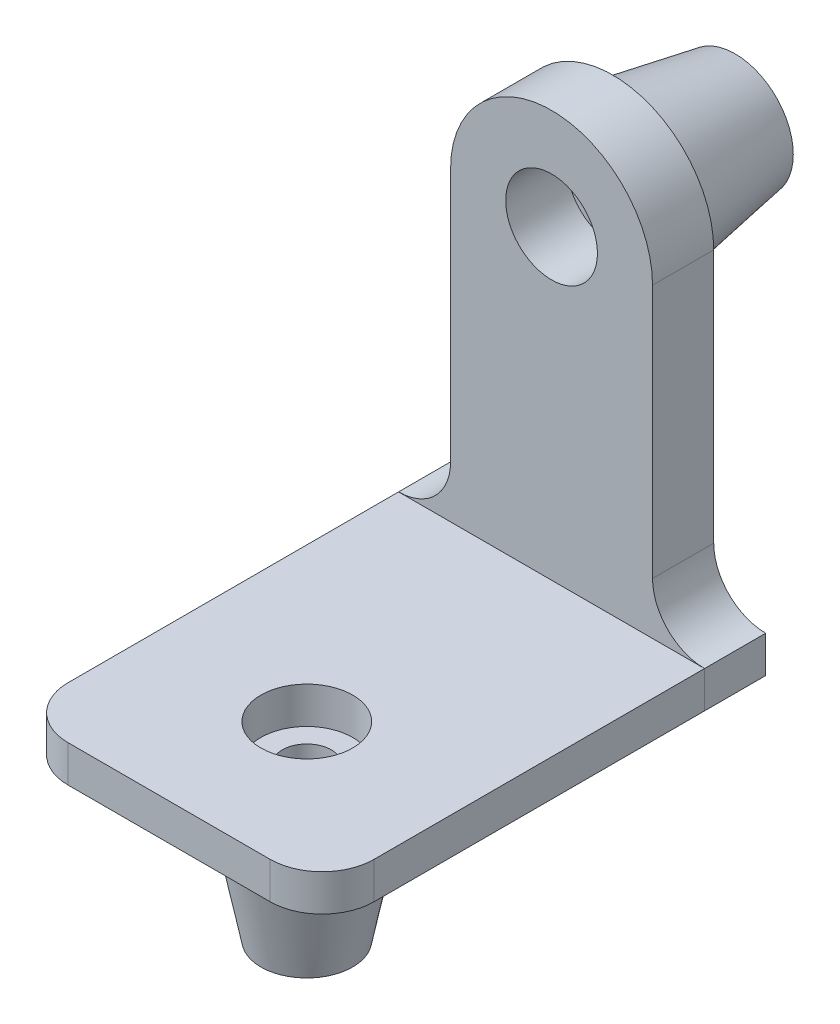
ISO-10303-21;
HEADER;
FILE_DESCRIPTION(('STEP AP214'),'2;1');
FILE_NAME('part.step','',(''),(''),'','','');
FILE_SCHEMA(('AUTOMOTIVE_DESIGN { 1 0 10303 214 1 1 1 1 }'));
ENDSEC;
DATA;
#1=APPLICATION_CONTEXT('core data for automotive mechanical design processes');
#2=APPLICATION_PROTOCOL_DEFINITION('international standard','automotive_design',2000,#1);
#3=PRODUCT_CONTEXT('',#1,'mechanical');
#4=PRODUCT('Part','Part','',(#3));
#5=PRODUCT_RELATED_PRODUCT_CATEGORY('part','',(#4));
#6=PRODUCT_DEFINITION_FORMATION('','',#4);
#7=PRODUCT_DEFINITION_CONTEXT('part definition',#1,'design');
#8=PRODUCT_DEFINITION('design','',#6,#7);
#9=PRODUCT_DEFINITION_SHAPE('','',#8);
#10=(LENGTH_UNIT() NAMED_UNIT(*) SI_UNIT(.MILLI.,.METRE.));
#11=(NAMED_UNIT(*) PLANE_ANGLE_UNIT() SI_UNIT($,.RADIAN.));
#12=(NAMED_UNIT(*) SI_UNIT($,.STERADIAN.) SOLID_ANGLE_UNIT());
#13=UNCERTAINTY_MEASURE_WITH_UNIT(LENGTH_MEASURE(1.E-05),#10,'distance_accuracy_value','');
#14=(GEOMETRIC_REPRESENTATION_CONTEXT(3) GLOBAL_UNCERTAINTY_ASSIGNED_CONTEXT((#13)) GLOBAL_UNIT_ASSIGNED_CONTEXT((#10,
#11,#12)) REPRESENTATION_CONTEXT('',''));
#15=CARTESIAN_POINT('',(0.,0.,0.));
#16=DIRECTION('',(0.,0.,1.));
#17=DIRECTION('',(1.,0.,0.));
#18=AXIS2_PLACEMENT_3D('',#15,#16,#17);
#19=CARTESIAN_POINT('',(50.,-12.,0.));
#20=DIRECTION('',(0.,0.,-1.));
#21=DIRECTION('',(-1.,0.,0.));
#22=AXIS2_PLACEMENT_3D('',#19,#20,#21);
#23=PLANE('',#22);
#24=DIRECTION('',(-1.,0.,0.));
#25=VECTOR('',#24,1.);
#26=CARTESIAN_POINT('',(50.,0.,0.));
#27=LINE('',#26,#25);
#28=CARTESIAN_POINT('',(50.,0.,0.));
#29=VERTEX_POINT('',#28);
#30=CARTESIAN_POINT('',(-50.,0.,0.));
#31=VERTEX_POINT('',#30);
#32=EDGE_CURVE('E117',#29,#31,#27,.T.);
#33=ORIENTED_EDGE('',*,*,#32,.T.);
#34=DIRECTION('',(0.,1.,0.));
#35=VECTOR('',#34,1.);
#36=CARTESIAN_POINT('',(-50.,-12.,0.));
#37=LINE('',#36,#35);
#38=CARTESIAN_POINT('',(-50.,-12.,0.));
#39=VERTEX_POINT('',#38);
#40=EDGE_CURVE('E13',#39,#31,#37,.T.);
#41=ORIENTED_EDGE('',*,*,#40,.F.);
#42=DIRECTION('',(-1.,0.,0.));
#43=VECTOR('',#42,1.);
#44=CARTESIAN_POINT('',(50.,-12.,0.));
#45=LINE('',#44,#43);
#46=CARTESIAN_POINT('',(50.,-12.,0.));
#47=VERTEX_POINT('',#46);
#48=EDGE_CURVE('E105',#47,#39,#45,.T.);
#49=ORIENTED_EDGE('',*,*,#48,.F.);
#50=DIRECTION('',(0.,1.,0.));
#51=VECTOR('',#50,1.);
#52=CARTESIAN_POINT('',(50.,-12.,0.));
#53=LINE('',#52,#51);
#54=EDGE_CURVE('E113',#47,#29,#53,.T.);
#55=ORIENTED_EDGE('',*,*,#54,.T.);
#56=EDGE_LOOP('',(#33,#41,#49,#55));
#57=FACE_BOUND('',#56,.T.);
#58=ADVANCED_FACE('F54',(#57),#23,.F.);
#59=CARTESIAN_POINT('',(-50.,-12.,0.));
#60=DIRECTION('',(1.,0.,0.));
#61=DIRECTION('',(0.,0.,-1.));
#62=AXIS2_PLACEMENT_3D('',#59,#60,#61);
#63=PLANE('',#62);
#64=DIRECTION('',(0.,0.,-1.));
#65=VECTOR('',#64,1.);
#66=CARTESIAN_POINT('',(-50.,0.,0.));
#67=LINE('',#66,#65);
#68=CARTESIAN_POINT('',(-50.,0.,-20.));
#69=VERTEX_POINT('',#68);
#70=EDGE_CURVE('E109',#31,#69,#67,.T.);
#71=ORIENTED_EDGE('',*,*,#70,.T.);
#72=DIRECTION('',(0.,1.,0.));
#73=VECTOR('',#72,1.);
#74=CARTESIAN_POINT('',(-50.,-12.,-20.));
#75=LINE('',#74,#73);
#76=CARTESIAN_POINT('',(-50.,-12.,-20.));
#77=VERTEX_POINT('',#76);
#78=EDGE_CURVE('E62',#77,#69,#75,.T.);
#79=ORIENTED_EDGE('',*,*,#78,.F.);
#80=DIRECTION('',(0.,0.,-1.));
#81=VECTOR('',#80,1.);
#82=CARTESIAN_POINT('',(-50.,-12.,0.));
#83=LINE('',#82,#81);
#84=EDGE_CURVE('E100',#39,#77,#83,.T.);
#85=ORIENTED_EDGE('',*,*,#84,.F.);
#86=ORIENTED_EDGE('',*,*,#40,.T.);
#87=EDGE_LOOP('',(#71,#79,#85,#86));
#88=FACE_BOUND('',#87,.T.);
#89=ADVANCED_FACE('F108',(#88),#63,.F.);
#90=CARTESIAN_POINT('',(-50.,-12.,-20.));
#91=DIRECTION('',(0.,0.,1.));
#92=DIRECTION('',(1.,0.,0.));
#93=AXIS2_PLACEMENT_3D('',#90,#91,#92);
#94=PLANE('',#93);
#95=DIRECTION('',(1.,0.,0.));
#96=VECTOR('',#95,1.);
#97=CARTESIAN_POINT('',(-50.,0.,-20.));
#98=LINE('',#97,#96);
#99=CARTESIAN_POINT('',(50.,0.,-20.));
#100=VERTEX_POINT('',#99);
#101=EDGE_CURVE('E87',#69,#100,#98,.T.);
#102=ORIENTED_EDGE('',*,*,#101,.T.);
#103=DIRECTION('',(0.,1.,0.));
#104=VECTOR('',#103,1.);
#105=CARTESIAN_POINT('',(50.,-12.,-20.));
#106=LINE('',#105,#104);
#107=CARTESIAN_POINT('',(50.,-12.,-20.));
#108=VERTEX_POINT('',#107);
#109=EDGE_CURVE('E110',#108,#100,#106,.T.);
#110=ORIENTED_EDGE('',*,*,#109,.F.);
#111=DIRECTION('',(1.,0.,0.));
#112=VECTOR('',#111,1.);
#113=CARTESIAN_POINT('',(-50.,-12.,-20.));
#114=LINE('',#113,#112);
#115=EDGE_CURVE('E103',#77,#108,#114,.T.);
#116=ORIENTED_EDGE('',*,*,#115,.F.);
#117=ORIENTED_EDGE('',*,*,#78,.T.);
#118=EDGE_LOOP('',(#102,#110,#116,#117));
#119=FACE_BOUND('',#118,.T.);
#120=ADVANCED_FACE('F111',(#119),#94,.F.);
#121=CARTESIAN_POINT('',(50.,-12.,-20.));
#122=DIRECTION('',(-1.,0.,0.));
#123=DIRECTION('',(0.,0.,1.));
#124=AXIS2_PLACEMENT_3D('',#121,#122,#123);
#125=PLANE('',#124);
#126=DIRECTION('',(0.,0.,1.));
#127=VECTOR('',#126,1.);
#128=CARTESIAN_POINT('',(50.,0.,-20.));
#129=LINE('',#128,#127);
#130=EDGE_CURVE('E93',#100,#29,#129,.T.);
#131=ORIENTED_EDGE('',*,*,#130,.T.);
#132=ORIENTED_EDGE('',*,*,#54,.F.);
#133=DIRECTION('',(0.,0.,1.));
#134=VECTOR('',#133,1.);
#135=CARTESIAN_POINT('',(50.,-12.,-20.));
#136=LINE('',#135,#134);
#137=EDGE_CURVE('E70',#108,#47,#136,.T.);
#138=ORIENTED_EDGE('',*,*,#137,.F.);
#139=ORIENTED_EDGE('',*,*,#109,.T.);
#140=EDGE_LOOP('',(#131,#132,#138,#139));
#141=FACE_BOUND('',#140,.T.);
#142=ADVANCED_FACE('F124',(#141),#125,.F.);
#143=CARTESIAN_POINT('',(0.,-12.,0.));
#144=DIRECTION('',(0.,-1.,0.));
#145=DIRECTION('',(0.,0.,-1.));
#146=AXIS2_PLACEMENT_3D('',#143,#144,#145);
#147=PLANE('',#146);
#148=ORIENTED_EDGE('',*,*,#48,.T.);
#149=ORIENTED_EDGE('',*,*,#84,.T.);
#150=ORIENTED_EDGE('',*,*,#115,.T.);
#151=ORIENTED_EDGE('',*,*,#137,.T.);
#152=EDGE_LOOP('',(#148,#149,#150,#151));
#153=FACE_BOUND('',#152,.T.);
#154=ADVANCED_FACE('F101',(#153),#147,.T.);
#155=CARTESIAN_POINT('',(0.,0.,0.));
#156=DIRECTION('',(0.,-1.,0.));
#157=DIRECTION('',(0.,0.,-1.));
#158=AXIS2_PLACEMENT_3D('',#155,#156,#157);
#159=PLANE('',#158);
#160=ORIENTED_EDGE('',*,*,#32,.F.);
#161=ORIENTED_EDGE('',*,*,#130,.F.);
#162=ORIENTED_EDGE('',*,*,#101,.F.);
#163=ORIENTED_EDGE('',*,*,#70,.F.);
#164=EDGE_LOOP('',(#160,#161,#162,#163));
#165=FACE_BOUND('',#164,.T.);
#166=ADVANCED_FACE('F127',(#165),#159,.F.);
#167=CLOSED_SHELL('',(#58,#89,#120,#142,#154,#166));
#168=MANIFOLD_SOLID_BREP('B2',#167);
#169=CARTESIAN_POINT('',(0.,-12.,0.));
#170=DIRECTION('',(0.,-1.,0.));
#171=DIRECTION('',(0.,0.,-1.));
#172=AXIS2_PLACEMENT_3D('',#169,#170,#171);
#173=PLANE('',#172);
#174=DIRECTION('',(1.,0.,0.));
#175=VECTOR('',#174,1.);
#176=CARTESIAN_POINT('',(50.,-12.,125.));
#177=LINE('',#176,#175);
#178=CARTESIAN_POINT('',(-33.,-12.,125.));
#179=VERTEX_POINT('',#178);
#180=CARTESIAN_POINT('',(33.,-12.,125.));
#181=VERTEX_POINT('',#180);
#182=EDGE_CURVE('E260',#179,#181,#177,.T.);
#183=ORIENTED_EDGE('',*,*,#182,.F.);
#184=CARTESIAN_POINT('',(-33.,-12.,108.));
#185=DIRECTION('',(0.,-1.,0.));
#186=DIRECTION('',(0.,0.,-1.));
#187=AXIS2_PLACEMENT_3D('',#184,#185,#186);
#188=CIRCLE('',#187,17.);
#189=CARTESIAN_POINT('',(-50.,-12.,108.));
#190=VERTEX_POINT('',#189);
#191=EDGE_CURVE('E196',#179,#190,#188,.T.);
#192=ORIENTED_EDGE('',*,*,#191,.T.);
#193=DIRECTION('',(0.,0.,1.));
#194=VECTOR('',#193,1.);
#195=CARTESIAN_POINT('',(-50.,-12.,125.));
#196=LINE('',#195,#194);
#197=CARTESIAN_POINT('',(-50.,-12.,0.));
#198=VERTEX_POINT('',#197);
#199=EDGE_CURVE('E245',#198,#190,#196,.T.);
#200=ORIENTED_EDGE('',*,*,#199,.F.);
#201=DIRECTION('',(-1.,0.,0.));
#202=VECTOR('',#201,1.);
#203=CARTESIAN_POINT('',(-50.,-12.,0.));
#204=LINE('',#203,#202);
#205=CARTESIAN_POINT('',(50.,-12.,0.));
#206=VERTEX_POINT('',#205);
#207=EDGE_CURVE('E258',#206,#198,#204,.T.);
#208=ORIENTED_EDGE('',*,*,#207,.F.);
#209=DIRECTION('',(0.,0.,-1.));
#210=VECTOR('',#209,1.);
#211=CARTESIAN_POINT('',(50.,-12.,0.));
#212=LINE('',#211,#210);
#213=CARTESIAN_POINT('',(50.,-12.,108.));
#214=VERTEX_POINT('',#213);
#215=EDGE_CURVE('E254',#214,#206,#212,.T.);
#216=ORIENTED_EDGE('',*,*,#215,.F.);
#217=CARTESIAN_POINT('',(33.,-12.,108.));
#218=DIRECTION('',(0.,-1.,0.));
#219=DIRECTION('',(0.,0.,-1.));
#220=AXIS2_PLACEMENT_3D('',#217,#218,#219);
#221=CIRCLE('',#220,17.);
#222=EDGE_CURVE('E208',#214,#181,#221,.T.);
#223=ORIENTED_EDGE('',*,*,#222,.T.);
#224=EDGE_LOOP('',(#183,#192,#200,#208,#216,#223));
#225=FACE_BOUND('',#224,.T.);
#226=CARTESIAN_POINT('',(0.,-12.,80.));
#227=DIRECTION('',(0.,-1.,0.));
#228=DIRECTION('',(0.,0.,-1.));
#229=AXIS2_PLACEMENT_3D('',#226,#227,#228);
#230=CIRCLE('',#229,25.);
#231=CARTESIAN_POINT('',(0.,-12.,55.));
#232=VERTEX_POINT('',#231);
#233=EDGE_CURVE('E409',#232,#232,#230,.T.);
#234=ORIENTED_EDGE('',*,*,#233,.F.);
#235=EDGE_LOOP('',(#234));
#236=FACE_BOUND('',#235,.T.);
#237=ADVANCED_FACE('F187',(#225,#236),#173,.T.);
#238=CARTESIAN_POINT('',(-50.,-12.,0.));
#239=DIRECTION('',(0.,0.,-1.));
#240=DIRECTION('',(-1.,0.,0.));
#241=AXIS2_PLACEMENT_3D('',#238,#239,#240);
#242=PLANE('',#241);
#243=DIRECTION('',(-1.,0.,0.));
#244=VECTOR('',#243,1.);
#245=CARTESIAN_POINT('',(-50.,0.,0.));
#246=LINE('',#245,#244);
#247=CARTESIAN_POINT('',(50.,0.,0.));
#248=VERTEX_POINT('',#247);
#249=CARTESIAN_POINT('',(-50.,0.,0.));
#250=VERTEX_POINT('',#249);
#251=EDGE_CURVE('E275',#248,#250,#246,.T.);
#252=ORIENTED_EDGE('',*,*,#251,.F.);
#253=DIRECTION('',(0.,1.,0.));
#254=VECTOR('',#253,1.);
#255=CARTESIAN_POINT('',(50.,-12.,0.));
#256=LINE('',#255,#254);
#257=EDGE_CURVE('E253',#206,#248,#256,.T.);
#258=ORIENTED_EDGE('',*,*,#257,.F.);
#259=ORIENTED_EDGE('',*,*,#207,.T.);
#260=DIRECTION('',(0.,1.,0.));
#261=VECTOR('',#260,1.);
#262=CARTESIAN_POINT('',(-50.,-12.,0.));
#263=LINE('',#262,#261);
#264=EDGE_CURVE('E241',#198,#250,#263,.T.);
#265=ORIENTED_EDGE('',*,*,#264,.T.);
#266=EDGE_LOOP('',(#252,#258,#259,#265));
#267=FACE_BOUND('',#266,.T.);
#268=ADVANCED_FACE('F263',(#267),#242,.T.);
#269=CARTESIAN_POINT('',(50.,-12.,0.));
#270=DIRECTION('',(1.,0.,0.));
#271=DIRECTION('',(0.,0.,-1.));
#272=AXIS2_PLACEMENT_3D('',#269,#270,#271);
#273=PLANE('',#272);
#274=DIRECTION('',(0.,0.,-1.));
#275=VECTOR('',#274,1.);
#276=CARTESIAN_POINT('',(50.,0.,0.));
#277=LINE('',#276,#275);
#278=CARTESIAN_POINT('',(50.,0.,108.));
#279=VERTEX_POINT('',#278);
#280=EDGE_CURVE('E265',#279,#248,#277,.T.);
#281=ORIENTED_EDGE('',*,*,#280,.F.);
#282=DIRECTION('',(0.,1.,0.));
#283=VECTOR('',#282,1.);
#284=CARTESIAN_POINT('',(50.,-12.,108.));
#285=LINE('',#284,#283);
#286=EDGE_CURVE('E52',#279,#214,#285,.F.);
#287=ORIENTED_EDGE('',*,*,#286,.T.);
#288=ORIENTED_EDGE('',*,*,#215,.T.);
#289=ORIENTED_EDGE('',*,*,#257,.T.);
#290=EDGE_LOOP('',(#281,#287,#288,#289));
#291=FACE_BOUND('',#290,.T.);
#292=ADVANCED_FACE('F303',(#291),#273,.T.);
#293=CARTESIAN_POINT('',(50.,-12.,125.));
#294=DIRECTION('',(0.,0.,1.));
#295=DIRECTION('',(1.,0.,0.));
#296=AXIS2_PLACEMENT_3D('',#293,#294,#295);
#297=PLANE('',#296);
#298=DIRECTION('',(1.,0.,0.));
#299=VECTOR('',#298,1.);
#300=CARTESIAN_POINT('',(50.,0.,125.));
#301=LINE('',#300,#299);
#302=CARTESIAN_POINT('',(-33.,0.,125.));
#303=VERTEX_POINT('',#302);
#304=CARTESIAN_POINT('',(33.,0.,125.));
#305=VERTEX_POINT('',#304);
#306=EDGE_CURVE('E267',#303,#305,#301,.T.);
#307=ORIENTED_EDGE('',*,*,#306,.F.);
#308=DIRECTION('',(0.,1.,0.));
#309=VECTOR('',#308,1.);
#310=CARTESIAN_POINT('',(-33.,-12.,125.));
#311=LINE('',#310,#309);
#312=EDGE_CURVE('E291',#303,#179,#311,.F.);
#313=ORIENTED_EDGE('',*,*,#312,.T.);
#314=ORIENTED_EDGE('',*,*,#182,.T.);
#315=DIRECTION('',(0.,1.,0.));
#316=VECTOR('',#315,1.);
#317=CARTESIAN_POINT('',(33.,-12.,125.));
#318=LINE('',#317,#316);
#319=EDGE_CURVE('E288',#181,#305,#318,.T.);
#320=ORIENTED_EDGE('',*,*,#319,.T.);
#321=EDGE_LOOP('',(#307,#313,#314,#320));
#322=FACE_BOUND('',#321,.T.);
#323=ADVANCED_FACE('F297',(#322),#297,.T.);
#324=CARTESIAN_POINT('',(-50.,-12.,125.));
#325=DIRECTION('',(-1.,0.,0.));
#326=DIRECTION('',(0.,0.,1.));
#327=AXIS2_PLACEMENT_3D('',#324,#325,#326);
#328=PLANE('',#327);
#329=ORIENTED_EDGE('',*,*,#199,.T.);
#330=DIRECTION('',(0.,1.,0.));
#331=VECTOR('',#330,1.);
#332=CARTESIAN_POINT('',(-50.,-12.,108.));
#333=LINE('',#332,#331);
#334=CARTESIAN_POINT('',(-50.,0.,108.));
#335=VERTEX_POINT('',#334);
#336=EDGE_CURVE('E281',#190,#335,#333,.T.);
#337=ORIENTED_EDGE('',*,*,#336,.T.);
#338=DIRECTION('',(0.,0.,1.));
#339=VECTOR('',#338,1.);
#340=CARTESIAN_POINT('',(-50.,0.,125.));
#341=LINE('',#340,#339);
#342=EDGE_CURVE('E248',#250,#335,#341,.T.);
#343=ORIENTED_EDGE('',*,*,#342,.F.);
#344=ORIENTED_EDGE('',*,*,#264,.F.);
#345=EDGE_LOOP('',(#329,#337,#343,#344));
#346=FACE_BOUND('',#345,.T.);
#347=ADVANCED_FACE('F243',(#346),#328,.T.);
#348=CARTESIAN_POINT('',(0.,0.,0.));
#349=DIRECTION('',(0.,-1.,0.));
#350=DIRECTION('',(0.,0.,-1.));
#351=AXIS2_PLACEMENT_3D('',#348,#349,#350);
#352=PLANE('',#351);
#353=CARTESIAN_POINT('',(0.,0.,80.));
#354=DIRECTION('',(0.,1.,0.));
#355=DIRECTION('',(0.,0.,1.));
#356=AXIS2_PLACEMENT_3D('',#353,#354,#355);
#357=CIRCLE('',#356,15.);
#358=CARTESIAN_POINT('',(0.,0.,95.));
#359=VERTEX_POINT('',#358);
#360=EDGE_CURVE('E270',#359,#359,#357,.T.);
#361=ORIENTED_EDGE('',*,*,#360,.F.);
#362=EDGE_LOOP('',(#361));
#363=FACE_BOUND('',#362,.T.);
#364=ORIENTED_EDGE('',*,*,#342,.T.);
#365=CARTESIAN_POINT('',(-33.,0.,108.));
#366=DIRECTION('',(0.,-1.,0.));
#367=DIRECTION('',(0.,0.,-1.));
#368=AXIS2_PLACEMENT_3D('',#365,#366,#367);
#369=CIRCLE('',#368,17.);
#370=EDGE_CURVE('E286',#335,#303,#369,.F.);
#371=ORIENTED_EDGE('',*,*,#370,.T.);
#372=ORIENTED_EDGE('',*,*,#306,.T.);
#373=CARTESIAN_POINT('',(33.,0.,108.));
#374=DIRECTION('',(0.,-1.,0.));
#375=DIRECTION('',(0.,0.,-1.));
#376=AXIS2_PLACEMENT_3D('',#373,#374,#375);
#377=CIRCLE('',#376,17.);
#378=EDGE_CURVE('E284',#305,#279,#377,.F.);
#379=ORIENTED_EDGE('',*,*,#378,.T.);
#380=ORIENTED_EDGE('',*,*,#280,.T.);
#381=ORIENTED_EDGE('',*,*,#251,.T.);
#382=EDGE_LOOP('',(#364,#371,#372,#379,#380,#381));
#383=FACE_BOUND('',#382,.T.);
#384=ADVANCED_FACE('F302',(#363,#383),#352,.F.);
#385=CARTESIAN_POINT('',(0.,-12.,80.));
#386=DIRECTION('',(0.,1.,0.));
#387=DIRECTION('',(0.,0.,1.));
#388=AXIS2_PLACEMENT_3D('',#385,#386,#387);
#389=CYLINDRICAL_SURFACE('',#388,15.);
#390=CARTESIAN_POINT('',(0.,-12.,80.));
#391=DIRECTION('',(0.,1.,0.));
#392=DIRECTION('',(0.,0.,1.));
#393=AXIS2_PLACEMENT_3D('',#390,#391,#392);
#394=CIRCLE('',#393,15.);
#395=CARTESIAN_POINT('',(0.,-12.,95.));
#396=VERTEX_POINT('',#395);
#397=EDGE_CURVE('E277',#396,#396,#394,.T.);
#398=ORIENTED_EDGE('',*,*,#397,.F.);
#399=EDGE_LOOP('',(#398));
#400=FACE_BOUND('',#399,.T.);
#401=ORIENTED_EDGE('',*,*,#360,.T.);
#402=EDGE_LOOP('',(#401));
#403=FACE_BOUND('',#402,.T.);
#404=ADVANCED_FACE('F314',(#400,#403),#389,.F.);
#405=CARTESIAN_POINT('',(-33.,-12.,108.));
#406=DIRECTION('',(0.,1.,0.));
#407=DIRECTION('',(0.,0.,1.));
#408=AXIS2_PLACEMENT_3D('',#405,#406,#407);
#409=CYLINDRICAL_SURFACE('',#408,17.);
#410=ORIENTED_EDGE('',*,*,#191,.F.);
#411=ORIENTED_EDGE('',*,*,#312,.F.);
#412=ORIENTED_EDGE('',*,*,#370,.F.);
#413=ORIENTED_EDGE('',*,*,#336,.F.);
#414=EDGE_LOOP('',(#410,#411,#412,#413));
#415=FACE_BOUND('',#414,.T.);
#416=ADVANCED_FACE('F300',(#415),#409,.T.);
#417=CARTESIAN_POINT('',(33.,-12.,108.));
#418=DIRECTION('',(0.,1.,0.));
#419=DIRECTION('',(0.,0.,1.));
#420=AXIS2_PLACEMENT_3D('',#417,#418,#419);
#421=CYLINDRICAL_SURFACE('',#420,17.);
#422=ORIENTED_EDGE('',*,*,#222,.F.);
#423=ORIENTED_EDGE('',*,*,#286,.F.);
#424=ORIENTED_EDGE('',*,*,#378,.F.);
#425=ORIENTED_EDGE('',*,*,#319,.F.);
#426=EDGE_LOOP('',(#422,#423,#424,#425));
#427=FACE_BOUND('',#426,.T.);
#428=ADVANCED_FACE('F189',(#427),#421,.T.);
#429=CARTESIAN_POINT('',(0.,-62.,80.));
#430=DIRECTION('',(0.,1.,0.));
#431=DIRECTION('',(0.,0.,1.));
#432=AXIS2_PLACEMENT_3D('',#429,#430,#431);
#433=CONICAL_SURFACE('',#432,15.,0.197395559849881);
#434=ORIENTED_EDGE('',*,*,#233,.T.);
#435=EDGE_LOOP('',(#434));
#436=FACE_BOUND('',#435,.T.);
#437=CARTESIAN_POINT('',(0.,-62.,80.));
#438=DIRECTION('',(0.,1.,0.));
#439=DIRECTION('',(0.,0.,1.));
#440=AXIS2_PLACEMENT_3D('',#437,#438,#439);
#441=CIRCLE('',#440,15.);
#442=CARTESIAN_POINT('',(0.,-62.,95.));
#443=VERTEX_POINT('',#442);
#444=EDGE_CURVE('E417',#443,#443,#441,.T.);
#445=ORIENTED_EDGE('',*,*,#444,.T.);
#446=EDGE_LOOP('',(#445));
#447=FACE_BOUND('',#446,.T.);
#448=ADVANCED_FACE('F306',(#436,#447),#433,.T.);
#449=CARTESIAN_POINT('',(0.,-62.,80.));
#450=DIRECTION('',(0.,1.,0.));
#451=DIRECTION('',(0.,0.,1.));
#452=AXIS2_PLACEMENT_3D('',#449,#450,#451);
#453=PLANE('',#452);
#454=CARTESIAN_POINT('',(0.,-62.,80.));
#455=DIRECTION('',(0.,1.,0.));
#456=DIRECTION('',(0.,0.,1.));
#457=AXIS2_PLACEMENT_3D('',#454,#455,#456);
#458=CIRCLE('',#457,8.);
#459=CARTESIAN_POINT('',(0.,-62.,88.));
#460=VERTEX_POINT('',#459);
#461=EDGE_CURVE('E191',#460,#460,#458,.T.);
#462=ORIENTED_EDGE('',*,*,#461,.T.);
#463=EDGE_LOOP('',(#462));
#464=FACE_BOUND('',#463,.T.);
#465=ORIENTED_EDGE('',*,*,#444,.F.);
#466=EDGE_LOOP('',(#465));
#467=FACE_BOUND('',#466,.T.);
#468=ADVANCED_FACE('F311',(#464,#467),#453,.F.);
#469=CARTESIAN_POINT('',(0.,-12.,80.));
#470=DIRECTION('',(0.,-1.,0.));
#471=DIRECTION('',(0.,0.,-1.));
#472=AXIS2_PLACEMENT_3D('',#469,#470,#471);
#473=PLANE('',#472);
#474=CARTESIAN_POINT('',(0.,-12.,80.));
#475=DIRECTION('',(0.,1.,0.));
#476=DIRECTION('',(0.,0.,1.));
#477=AXIS2_PLACEMENT_3D('',#474,#475,#476);
#478=CIRCLE('',#477,8.);
#479=CARTESIAN_POINT('',(0.,-12.,88.));
#480=VERTEX_POINT('',#479);
#481=EDGE_CURVE('E440',#480,#480,#478,.T.);
#482=ORIENTED_EDGE('',*,*,#481,.F.);
#483=EDGE_LOOP('',(#482));
#484=FACE_BOUND('',#483,.T.);
#485=ORIENTED_EDGE('',*,*,#397,.T.);
#486=EDGE_LOOP('',(#485));
#487=FACE_BOUND('',#486,.T.);
#488=ADVANCED_FACE('F375',(#484,#487),#473,.F.);
#489=CARTESIAN_POINT('',(0.,-62.0001,80.));
#490=DIRECTION('',(0.,1.,0.));
#491=DIRECTION('',(0.,0.,1.));
#492=AXIS2_PLACEMENT_3D('',#489,#490,#491);
#493=CYLINDRICAL_SURFACE('',#492,8.);
#494=ORIENTED_EDGE('',*,*,#481,.T.);
#495=EDGE_LOOP('',(#494));
#496=FACE_BOUND('',#495,.T.);
#497=ORIENTED_EDGE('',*,*,#461,.F.);
#498=EDGE_LOOP('',(#497));
#499=FACE_BOUND('',#498,.T.);
#500=ADVANCED_FACE('F384',(#496,#499),#493,.F.);
#501=CLOSED_SHELL('',(#237,#268,#292,#323,#347,#384,#404,#416,#428,#448,#468,#488,#500));
#502=MANIFOLD_SOLID_BREP('B7',#501);
#503=CARTESIAN_POINT('',(50.,17.,-20.));
#504=DIRECTION('',(0.,0.,1.));
#505=DIRECTION('',(1.,0.,0.));
#506=AXIS2_PLACEMENT_3D('',#503,#504,#505);
#507=CYLINDRICAL_SURFACE('',#506,17.);
#508=CARTESIAN_POINT('',(50.,17.,0.));
#509=DIRECTION('',(0.,0.,-1.));
#510=DIRECTION('',(1.,0.,0.));
#511=AXIS2_PLACEMENT_3D('',#508,#509,#510);
#512=CIRCLE('',#511,17.);
#513=CARTESIAN_POINT('',(50.,0.,0.));
#514=VERTEX_POINT('',#513);
#515=CARTESIAN_POINT('',(33.,17.,0.));
#516=VERTEX_POINT('',#515);
#517=EDGE_CURVE('E558',#514,#516,#512,.T.);
#518=ORIENTED_EDGE('',*,*,#517,.F.);
#519=DIRECTION('',(0.,0.,1.));
#520=VECTOR('',#519,1.);
#521=CARTESIAN_POINT('',(50.,0.,-20.));
#522=LINE('',#521,#520);
#523=CARTESIAN_POINT('',(50.,0.,-20.));
#524=VERTEX_POINT('',#523);
#525=EDGE_CURVE('E185',#524,#514,#522,.T.);
#526=ORIENTED_EDGE('',*,*,#525,.F.);
#527=CARTESIAN_POINT('',(50.,17.,-20.));
#528=DIRECTION('',(0.,0.,-1.));
#529=DIRECTION('',(1.,0.,0.));
#530=AXIS2_PLACEMENT_3D('',#527,#528,#529);
#531=CIRCLE('',#530,17.);
#532=CARTESIAN_POINT('',(33.,17.,-20.));
#533=VERTEX_POINT('',#532);
#534=EDGE_CURVE('E579',#524,#533,#531,.T.);
#535=ORIENTED_EDGE('',*,*,#534,.T.);
#536=DIRECTION('',(0.,0.,1.));
#537=VECTOR('',#536,1.);
#538=CARTESIAN_POINT('',(33.,17.,-20.));
#539=LINE('',#538,#537);
#540=EDGE_CURVE('E517',#533,#516,#539,.T.);
#541=ORIENTED_EDGE('',*,*,#540,.T.);
#542=EDGE_LOOP('',(#518,#526,#535,#541));
#543=FACE_BOUND('',#542,.T.);
#544=ADVANCED_FACE('F466',(#543),#507,.F.);
#545=CARTESIAN_POINT('',(-50.,0.,-20.));
#546=DIRECTION('',(0.,-1.,0.));
#547=DIRECTION('',(0.,0.,-1.));
#548=AXIS2_PLACEMENT_3D('',#545,#546,#547);
#549=PLANE('',#548);
#550=DIRECTION('',(1.,0.,0.));
#551=VECTOR('',#550,1.);
#552=CARTESIAN_POINT('',(-50.,0.,0.));
#553=LINE('',#552,#551);
#554=CARTESIAN_POINT('',(-50.,0.,0.));
#555=VERTEX_POINT('',#554);
#556=EDGE_CURVE('E576',#555,#514,#553,.T.);
#557=ORIENTED_EDGE('',*,*,#556,.F.);
#558=DIRECTION('',(0.,0.,1.));
#559=VECTOR('',#558,1.);
#560=CARTESIAN_POINT('',(-50.,0.,-20.));
#561=LINE('',#560,#559);
#562=CARTESIAN_POINT('',(-50.,0.,-20.));
#563=VERTEX_POINT('',#562);
#564=EDGE_CURVE('E476',#563,#555,#561,.T.);
#565=ORIENTED_EDGE('',*,*,#564,.F.);
#566=DIRECTION('',(1.,0.,0.));
#567=VECTOR('',#566,1.);
#568=CARTESIAN_POINT('',(-50.,0.,-20.));
#569=LINE('',#568,#567);
#570=EDGE_CURVE('E544',#563,#524,#569,.T.);
#571=ORIENTED_EDGE('',*,*,#570,.T.);
#572=ORIENTED_EDGE('',*,*,#525,.T.);
#573=EDGE_LOOP('',(#557,#565,#571,#572));
#574=FACE_BOUND('',#573,.T.);
#575=ADVANCED_FACE('F592',(#574),#549,.T.);
#576=CARTESIAN_POINT('',(-50.,17.,-20.));
#577=DIRECTION('',(0.,0.,1.));
#578=DIRECTION('',(1.,0.,0.));
#579=AXIS2_PLACEMENT_3D('',#576,#577,#578);
#580=CYLINDRICAL_SURFACE('',#579,17.);
#581=CARTESIAN_POINT('',(-50.,17.,0.));
#582=DIRECTION('',(0.,0.,-1.));
#583=DIRECTION('',(1.,0.,0.));
#584=AXIS2_PLACEMENT_3D('',#581,#582,#583);
#585=CIRCLE('',#584,17.);
#586=CARTESIAN_POINT('',(-33.,17.,0.));
#587=VERTEX_POINT('',#586);
#588=EDGE_CURVE('E530',#587,#555,#585,.T.);
#589=ORIENTED_EDGE('',*,*,#588,.F.);
#590=DIRECTION('',(0.,0.,1.));
#591=VECTOR('',#590,1.);
#592=CARTESIAN_POINT('',(-33.,17.,-20.));
#593=LINE('',#592,#591);
#594=CARTESIAN_POINT('',(-33.,17.,-20.));
#595=VERTEX_POINT('',#594);
#596=EDGE_CURVE('E525',#595,#587,#593,.T.);
#597=ORIENTED_EDGE('',*,*,#596,.F.);
#598=CARTESIAN_POINT('',(-50.,17.,-20.));
#599=DIRECTION('',(0.,0.,-1.));
#600=DIRECTION('',(1.,0.,0.));
#601=AXIS2_PLACEMENT_3D('',#598,#599,#600);
#602=CIRCLE('',#601,17.);
#603=EDGE_CURVE('E528',#595,#563,#602,.T.);
#604=ORIENTED_EDGE('',*,*,#603,.T.);
#605=ORIENTED_EDGE('',*,*,#564,.T.);
#606=EDGE_LOOP('',(#589,#597,#604,#605));
#607=FACE_BOUND('',#606,.T.);
#608=ADVANCED_FACE('F527',(#607),#580,.F.);
#609=CARTESIAN_POINT('',(-33.,100.,-20.));
#610=DIRECTION('',(-1.,0.,0.));
#611=DIRECTION('',(0.,0.,1.));
#612=AXIS2_PLACEMENT_3D('',#609,#610,#611);
#613=PLANE('',#612);
#614=DIRECTION('',(0.,-1.,0.));
#615=VECTOR('',#614,1.);
#616=CARTESIAN_POINT('',(-33.,100.,0.));
#617=LINE('',#616,#615);
#618=CARTESIAN_POINT('',(-33.,100.,0.));
#619=VERTEX_POINT('',#618);
#620=EDGE_CURVE('E571',#619,#587,#617,.T.);
#621=ORIENTED_EDGE('',*,*,#620,.F.);
#622=DIRECTION('',(0.,0.,1.));
#623=VECTOR('',#622,1.);
#624=CARTESIAN_POINT('',(-33.,100.,-20.));
#625=LINE('',#624,#623);
#626=CARTESIAN_POINT('',(-33.,100.,-20.));
#627=VERTEX_POINT('',#626);
#628=EDGE_CURVE('E536',#627,#619,#625,.T.);
#629=ORIENTED_EDGE('',*,*,#628,.F.);
#630=DIRECTION('',(0.,-1.,0.));
#631=VECTOR('',#630,1.);
#632=CARTESIAN_POINT('',(-33.,100.,-20.));
#633=LINE('',#632,#631);
#634=EDGE_CURVE('E542',#627,#595,#633,.T.);
#635=ORIENTED_EDGE('',*,*,#634,.T.);
#636=ORIENTED_EDGE('',*,*,#596,.T.);
#637=EDGE_LOOP('',(#621,#629,#635,#636));
#638=FACE_BOUND('',#637,.T.);
#639=ADVANCED_FACE('F547',(#638),#613,.T.);
#640=CARTESIAN_POINT('',(0.,100.,-20.));
#641=DIRECTION('',(0.,0.,1.));
#642=DIRECTION('',(1.,0.,0.));
#643=AXIS2_PLACEMENT_3D('',#640,#641,#642);
#644=CYLINDRICAL_SURFACE('',#643,33.);
#645=CARTESIAN_POINT('',(0.,100.,0.));
#646=DIRECTION('',(0.,0.,1.));
#647=DIRECTION('',(1.,0.,0.));
#648=AXIS2_PLACEMENT_3D('',#645,#646,#647);
#649=CIRCLE('',#648,33.);
#650=CARTESIAN_POINT('',(33.,100.,0.));
#651=VERTEX_POINT('',#650);
#652=EDGE_CURVE('E567',#651,#619,#649,.T.);
#653=ORIENTED_EDGE('',*,*,#652,.F.);
#654=DIRECTION('',(0.,0.,1.));
#655=VECTOR('',#654,1.);
#656=CARTESIAN_POINT('',(33.,100.,-20.));
#657=LINE('',#656,#655);
#658=CARTESIAN_POINT('',(33.,100.,-20.));
#659=VERTEX_POINT('',#658);
#660=EDGE_CURVE('E585',#659,#651,#657,.T.);
#661=ORIENTED_EDGE('',*,*,#660,.F.);
#662=CARTESIAN_POINT('',(0.,100.,-20.));
#663=DIRECTION('',(0.,0.,1.));
#664=DIRECTION('',(1.,0.,0.));
#665=AXIS2_PLACEMENT_3D('',#662,#663,#664);
#666=CIRCLE('',#665,33.);
#667=EDGE_CURVE('E549',#659,#627,#666,.T.);
#668=ORIENTED_EDGE('',*,*,#667,.T.);
#669=ORIENTED_EDGE('',*,*,#628,.T.);
#670=EDGE_LOOP('',(#653,#661,#668,#669));
#671=FACE_BOUND('',#670,.T.);
#672=ADVANCED_FACE('F605',(#671),#644,.T.);
#673=CARTESIAN_POINT('',(33.,100.,-20.));
#674=DIRECTION('',(1.,0.,0.));
#675=DIRECTION('',(0.,1.,0.));
#676=AXIS2_PLACEMENT_3D('',#673,#674,#675);
#677=PLANE('',#676);
#678=DIRECTION('',(0.,1.,0.));
#679=VECTOR('',#678,1.);
#680=CARTESIAN_POINT('',(33.,100.,0.));
#681=LINE('',#680,#679);
#682=EDGE_CURVE('E562',#516,#651,#681,.T.);
#683=ORIENTED_EDGE('',*,*,#682,.F.);
#684=ORIENTED_EDGE('',*,*,#540,.F.);
#685=DIRECTION('',(0.,1.,0.));
#686=VECTOR('',#685,1.);
#687=CARTESIAN_POINT('',(33.,100.,-20.));
#688=LINE('',#687,#686);
#689=EDGE_CURVE('E552',#533,#659,#688,.T.);
#690=ORIENTED_EDGE('',*,*,#689,.T.);
#691=ORIENTED_EDGE('',*,*,#660,.T.);
#692=EDGE_LOOP('',(#683,#684,#690,#691));
#693=FACE_BOUND('',#692,.T.);
#694=ADVANCED_FACE('F588',(#693),#677,.T.);
#695=CARTESIAN_POINT('',(50.,17.,-20.));
#696=DIRECTION('',(0.,0.,1.));
#697=DIRECTION('',(1.,0.,0.));
#698=AXIS2_PLACEMENT_3D('',#695,#696,#697);
#699=PLANE('',#698);
#700=CARTESIAN_POINT('',(0.,100.,-20.));
#701=DIRECTION('',(0.,0.,1.));
#702=DIRECTION('',(1.,0.,0.));
#703=AXIS2_PLACEMENT_3D('',#700,#701,#702);
#704=CIRCLE('',#703,26.);
#705=CARTESIAN_POINT('',(26.,100.,-20.));
#706=VERTEX_POINT('',#705);
#707=EDGE_CURVE('E662',#706,#706,#704,.T.);
#708=ORIENTED_EDGE('',*,*,#707,.T.);
#709=EDGE_LOOP('',(#708));
#710=FACE_BOUND('',#709,.T.);
#711=ORIENTED_EDGE('',*,*,#534,.F.);
#712=ORIENTED_EDGE('',*,*,#570,.F.);
#713=ORIENTED_EDGE('',*,*,#603,.F.);
#714=ORIENTED_EDGE('',*,*,#634,.F.);
#715=ORIENTED_EDGE('',*,*,#667,.F.);
#716=ORIENTED_EDGE('',*,*,#689,.F.);
#717=EDGE_LOOP('',(#711,#712,#713,#714,#715,#716));
#718=FACE_BOUND('',#717,.T.);
#719=ADVANCED_FACE('F540',(#710,#718),#699,.F.);
#720=CARTESIAN_POINT('',(50.,17.,0.));
#721=DIRECTION('',(0.,0.,1.));
#722=DIRECTION('',(1.,0.,0.));
#723=AXIS2_PLACEMENT_3D('',#720,#721,#722);
#724=PLANE('',#723);
#725=CARTESIAN_POINT('',(0.,100.,0.));
#726=DIRECTION('',(0.,0.,1.));
#727=DIRECTION('',(1.,0.,0.));
#728=AXIS2_PLACEMENT_3D('',#725,#726,#727);
#729=CIRCLE('',#728,15.);
#730=CARTESIAN_POINT('',(15.,100.,0.));
#731=VERTEX_POINT('',#730);
#732=EDGE_CURVE('E667',#731,#731,#729,.T.);
#733=ORIENTED_EDGE('',*,*,#732,.F.);
#734=EDGE_LOOP('',(#733));
#735=FACE_BOUND('',#734,.T.);
#736=ORIENTED_EDGE('',*,*,#517,.T.);
#737=ORIENTED_EDGE('',*,*,#682,.T.);
#738=ORIENTED_EDGE('',*,*,#652,.T.);
#739=ORIENTED_EDGE('',*,*,#620,.T.);
#740=ORIENTED_EDGE('',*,*,#588,.T.);
#741=ORIENTED_EDGE('',*,*,#556,.T.);
#742=EDGE_LOOP('',(#736,#737,#738,#739,#740,#741));
#743=FACE_BOUND('',#742,.T.);
#744=ADVANCED_FACE('F591',(#735,#743),#724,.T.);
#745=CARTESIAN_POINT('',(0.,100.,-20.));
#746=DIRECTION('',(0.,0.,1.));
#747=DIRECTION('',(1.,0.,0.));
#748=AXIS2_PLACEMENT_3D('',#745,#746,#747);
#749=CYLINDRICAL_SURFACE('',#748,15.);
#750=CARTESIAN_POINT('',(0.,100.,-20.));
#751=DIRECTION('',(0.,0.,1.));
#752=DIRECTION('',(1.,0.,0.));
#753=AXIS2_PLACEMENT_3D('',#750,#751,#752);
#754=CIRCLE('',#753,15.);
#755=CARTESIAN_POINT('',(15.,100.,-20.));
#756=VERTEX_POINT('',#755);
#757=EDGE_CURVE('E563',#756,#756,#754,.T.);
#758=ORIENTED_EDGE('',*,*,#757,.F.);
#759=EDGE_LOOP('',(#758));
#760=FACE_BOUND('',#759,.T.);
#761=ORIENTED_EDGE('',*,*,#732,.T.);
#762=EDGE_LOOP('',(#761));
#763=FACE_BOUND('',#762,.T.);
#764=ADVANCED_FACE('F616',(#760,#763),#749,.F.);
#765=CARTESIAN_POINT('',(0.,100.,-60.));
#766=DIRECTION('',(0.,0.,1.));
#767=DIRECTION('',(1.,0.,0.));
#768=AXIS2_PLACEMENT_3D('',#765,#766,#767);
#769=CONICAL_SURFACE('',#768,19.,0.173245666452365);
#770=CARTESIAN_POINT('',(0.,100.,-60.));
#771=DIRECTION('',(0.,0.,1.));
#772=DIRECTION('',(1.,0.,0.));
#773=AXIS2_PLACEMENT_3D('',#770,#771,#772);
#774=CIRCLE('',#773,19.);
#775=CARTESIAN_POINT('',(19.,100.,-60.));
#776=VERTEX_POINT('',#775);
#777=EDGE_CURVE('E651',#776,#776,#774,.T.);
#778=ORIENTED_EDGE('',*,*,#777,.T.);
#779=EDGE_LOOP('',(#778));
#780=FACE_BOUND('',#779,.T.);
#781=ORIENTED_EDGE('',*,*,#707,.F.);
#782=EDGE_LOOP('',(#781));
#783=FACE_BOUND('',#782,.T.);
#784=ADVANCED_FACE('F622',(#780,#783),#769,.T.);
#785=CARTESIAN_POINT('',(0.,100.,-60.));
#786=DIRECTION('',(0.,0.,1.));
#787=DIRECTION('',(1.,0.,0.));
#788=AXIS2_PLACEMENT_3D('',#785,#786,#787);
#789=PLANE('',#788);
#790=CARTESIAN_POINT('',(0.,100.,-60.));
#791=DIRECTION('',(0.,0.,1.));
#792=DIRECTION('',(1.,0.,0.));
#793=AXIS2_PLACEMENT_3D('',#790,#791,#792);
#794=CIRCLE('',#793,10.);
#795=CARTESIAN_POINT('',(10.,100.,-60.));
#796=VERTEX_POINT('',#795);
#797=EDGE_CURVE('E469',#796,#796,#794,.T.);
#798=ORIENTED_EDGE('',*,*,#797,.T.);
#799=EDGE_LOOP('',(#798));
#800=FACE_BOUND('',#799,.T.);
#801=ORIENTED_EDGE('',*,*,#777,.F.);
#802=EDGE_LOOP('',(#801));
#803=FACE_BOUND('',#802,.T.);
#804=ADVANCED_FACE('F628',(#800,#803),#789,.F.);
#805=CARTESIAN_POINT('',(0.,100.,-20.));
#806=DIRECTION('',(0.,0.,1.));
#807=DIRECTION('',(1.,0.,0.));
#808=AXIS2_PLACEMENT_3D('',#805,#806,#807);
#809=PLANE('',#808);
#810=CARTESIAN_POINT('',(0.,100.,-20.));
#811=DIRECTION('',(0.,0.,1.));
#812=DIRECTION('',(1.,0.,0.));
#813=AXIS2_PLACEMENT_3D('',#810,#811,#812);
#814=CIRCLE('',#813,10.);
#815=CARTESIAN_POINT('',(10.,100.,-20.));
#816=VERTEX_POINT('',#815);
#817=EDGE_CURVE('E679',#816,#816,#814,.T.);
#818=ORIENTED_EDGE('',*,*,#817,.F.);
#819=EDGE_LOOP('',(#818));
#820=FACE_BOUND('',#819,.T.);
#821=ORIENTED_EDGE('',*,*,#757,.T.);
#822=EDGE_LOOP('',(#821));
#823=FACE_BOUND('',#822,.T.);
#824=ADVANCED_FACE('F624',(#820,#823),#809,.T.);
#825=CARTESIAN_POINT('',(0.,100.,-60.0001));
#826=DIRECTION('',(0.,0.,1.));
#827=DIRECTION('',(1.,0.,0.));
#828=AXIS2_PLACEMENT_3D('',#825,#826,#827);
#829=CYLINDRICAL_SURFACE('',#828,10.);
#830=ORIENTED_EDGE('',*,*,#817,.T.);
#831=EDGE_LOOP('',(#830));
#832=FACE_BOUND('',#831,.T.);
#833=ORIENTED_EDGE('',*,*,#797,.F.);
#834=EDGE_LOOP('',(#833));
#835=FACE_BOUND('',#834,.T.);
#836=ADVANCED_FACE('F627',(#832,#835),#829,.F.);
#837=CLOSED_SHELL('',(#544,#575,#608,#639,#672,#694,#719,#744,#764,#784,#804,#824,#836));
#838=MANIFOLD_SOLID_BREP('B46',#837);
#839=ADVANCED_BREP_SHAPE_REPRESENTATION('',(#18,#168,#502,#838),#14);
#840=SHAPE_DEFINITION_REPRESENTATION(#9,#839);
ENDSEC;
END-ISO-10303-21;
